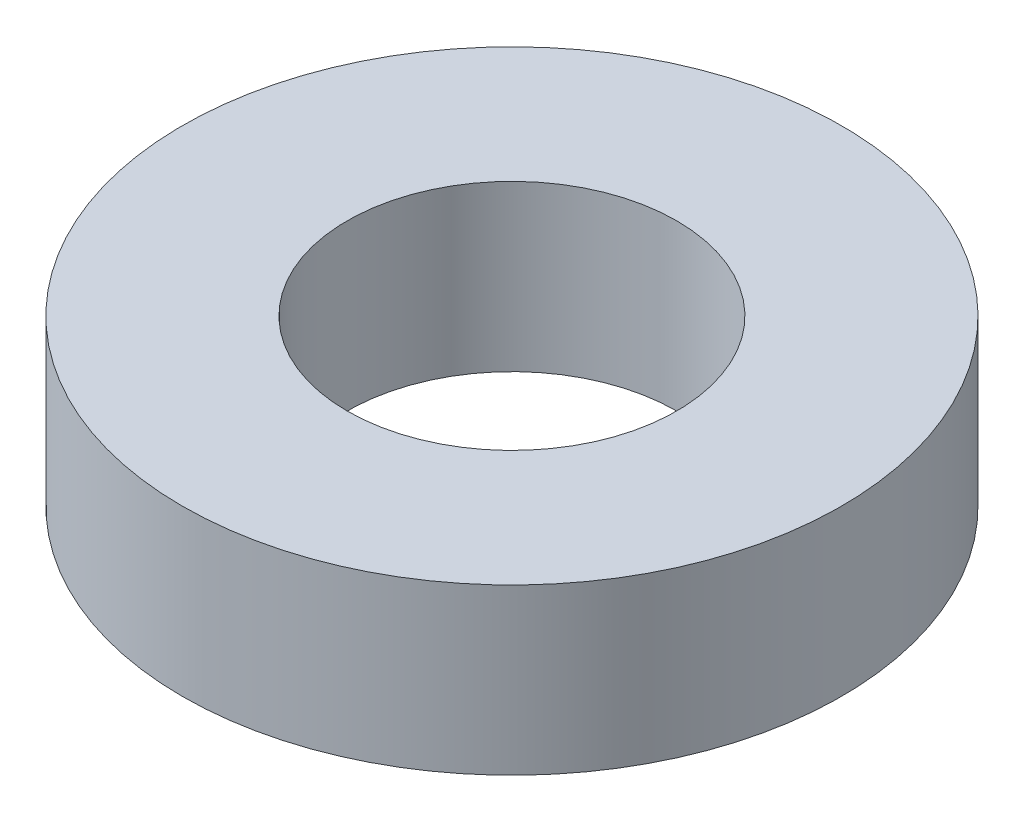
ISO-10303-21;
HEADER;
FILE_DESCRIPTION(('STEP AP214'),'2;1');
FILE_NAME('part.step','',(''),(''),'','','');
FILE_SCHEMA(('AUTOMOTIVE_DESIGN { 1 0 10303 214 1 1 1 1 }'));
ENDSEC;
DATA;
#1=APPLICATION_CONTEXT('core data for automotive mechanical design processes');
#2=APPLICATION_PROTOCOL_DEFINITION('international standard','automotive_design',2000,#1);
#3=PRODUCT_CONTEXT('',#1,'mechanical');
#4=PRODUCT('Part','Part','',(#3));
#5=PRODUCT_RELATED_PRODUCT_CATEGORY('part','',(#4));
#6=PRODUCT_DEFINITION_FORMATION('','',#4);
#7=PRODUCT_DEFINITION_CONTEXT('part definition',#1,'design');
#8=PRODUCT_DEFINITION('design','',#6,#7);
#9=PRODUCT_DEFINITION_SHAPE('','',#8);
#10=(LENGTH_UNIT() NAMED_UNIT(*) SI_UNIT(.MILLI.,.METRE.));
#11=(NAMED_UNIT(*) PLANE_ANGLE_UNIT() SI_UNIT($,.RADIAN.));
#12=(NAMED_UNIT(*) SI_UNIT($,.STERADIAN.) SOLID_ANGLE_UNIT());
#13=UNCERTAINTY_MEASURE_WITH_UNIT(LENGTH_MEASURE(1.E-05),#10,'distance_accuracy_value','');
#14=(GEOMETRIC_REPRESENTATION_CONTEXT(3) GLOBAL_UNCERTAINTY_ASSIGNED_CONTEXT((#13)) GLOBAL_UNIT_ASSIGNED_CONTEXT((#10,
#11,#12)) REPRESENTATION_CONTEXT('',''));
#15=CARTESIAN_POINT('',(0.,0.,0.));
#16=DIRECTION('',(0.,0.,1.));
#17=DIRECTION('',(1.,0.,0.));
#18=AXIS2_PLACEMENT_3D('',#15,#16,#17);
#19=CARTESIAN_POINT('',(0.,6.35,0.));
#20=DIRECTION('',(0.,1.,0.));
#21=DIRECTION('',(0.,0.,1.));
#22=AXIS2_PLACEMENT_3D('',#19,#20,#21);
#23=PLANE('',#22);
#24=CARTESIAN_POINT('',(0.,6.35,0.));
#25=DIRECTION('',(0.,1.,0.));
#26=DIRECTION('',(0.,0.,1.));
#27=AXIS2_PLACEMENT_3D('',#24,#25,#26);
#28=CIRCLE('',#27,12.7);
#29=CARTESIAN_POINT('',(0.,6.35,12.7));
#30=VERTEX_POINT('',#29);
#31=EDGE_CURVE('E10',#30,#30,#28,.T.);
#32=ORIENTED_EDGE('',*,*,#31,.T.);
#33=EDGE_LOOP('',(#32));
#34=FACE_BOUND('',#33,.T.);
#35=CARTESIAN_POINT('',(0.,6.35,0.));
#36=DIRECTION('',(0.,1.,0.));
#37=DIRECTION('',(0.,0.,1.));
#38=AXIS2_PLACEMENT_3D('',#35,#36,#37);
#39=CIRCLE('',#38,6.35);
#40=CARTESIAN_POINT('',(0.,6.35,6.35));
#41=VERTEX_POINT('',#40);
#42=EDGE_CURVE('E42',#41,#41,#39,.T.);
#43=ORIENTED_EDGE('',*,*,#42,.F.);
#44=EDGE_LOOP('',(#43));
#45=FACE_BOUND('',#44,.T.);
#46=ADVANCED_FACE('F31',(#34,#45),#23,.T.);
#47=CARTESIAN_POINT('',(0.,0.,0.));
#48=DIRECTION('',(0.,1.,0.));
#49=DIRECTION('',(0.,0.,1.));
#50=AXIS2_PLACEMENT_3D('',#47,#48,#49);
#51=PLANE('',#50);
#52=CARTESIAN_POINT('',(0.,0.,0.));
#53=DIRECTION('',(0.,1.,0.));
#54=DIRECTION('',(0.,0.,1.));
#55=AXIS2_PLACEMENT_3D('',#52,#53,#54);
#56=CIRCLE('',#55,12.7);
#57=CARTESIAN_POINT('',(0.,0.,12.7));
#58=VERTEX_POINT('',#57);
#59=EDGE_CURVE('E35',#58,#58,#56,.T.);
#60=ORIENTED_EDGE('',*,*,#59,.F.);
#61=EDGE_LOOP('',(#60));
#62=FACE_BOUND('',#61,.T.);
#63=CARTESIAN_POINT('',(0.,0.,0.));
#64=DIRECTION('',(0.,1.,0.));
#65=DIRECTION('',(0.,0.,1.));
#66=AXIS2_PLACEMENT_3D('',#63,#64,#65);
#67=CIRCLE('',#66,6.35);
#68=CARTESIAN_POINT('',(0.,0.,6.35));
#69=VERTEX_POINT('',#68);
#70=EDGE_CURVE('E44',#69,#69,#67,.T.);
#71=ORIENTED_EDGE('',*,*,#70,.T.);
#72=EDGE_LOOP('',(#71));
#73=FACE_BOUND('',#72,.T.);
#74=ADVANCED_FACE('F54',(#62,#73),#51,.F.);
#75=CARTESIAN_POINT('',(0.,6.35,0.));
#76=DIRECTION('',(0.,-1.,0.));
#77=DIRECTION('',(0.,0.,-1.));
#78=AXIS2_PLACEMENT_3D('',#75,#76,#77);
#79=CYLINDRICAL_SURFACE('',#78,12.7);
#80=ORIENTED_EDGE('',*,*,#31,.F.);
#81=EDGE_LOOP('',(#80));
#82=FACE_BOUND('',#81,.T.);
#83=ORIENTED_EDGE('',*,*,#59,.T.);
#84=EDGE_LOOP('',(#83));
#85=FACE_BOUND('',#84,.T.);
#86=ADVANCED_FACE('F33',(#82,#85),#79,.T.);
#87=CARTESIAN_POINT('',(0.,6.35,0.));
#88=DIRECTION('',(0.,-1.,0.));
#89=DIRECTION('',(0.,0.,-1.));
#90=AXIS2_PLACEMENT_3D('',#87,#88,#89);
#91=CYLINDRICAL_SURFACE('',#90,6.35);
#92=ORIENTED_EDGE('',*,*,#42,.T.);
#93=EDGE_LOOP('',(#92));
#94=FACE_BOUND('',#93,.T.);
#95=ORIENTED_EDGE('',*,*,#70,.F.);
#96=EDGE_LOOP('',(#95));
#97=FACE_BOUND('',#96,.T.);
#98=ADVANCED_FACE('F50',(#94,#97),#91,.F.);
#99=CLOSED_SHELL('',(#46,#74,#86,#98));
#100=MANIFOLD_SOLID_BREP('B2',#99);
#101=ADVANCED_BREP_SHAPE_REPRESENTATION('',(#18,#100),#14);
#102=SHAPE_DEFINITION_REPRESENTATION(#9,#101);
ENDSEC;
END-ISO-10303-21;
